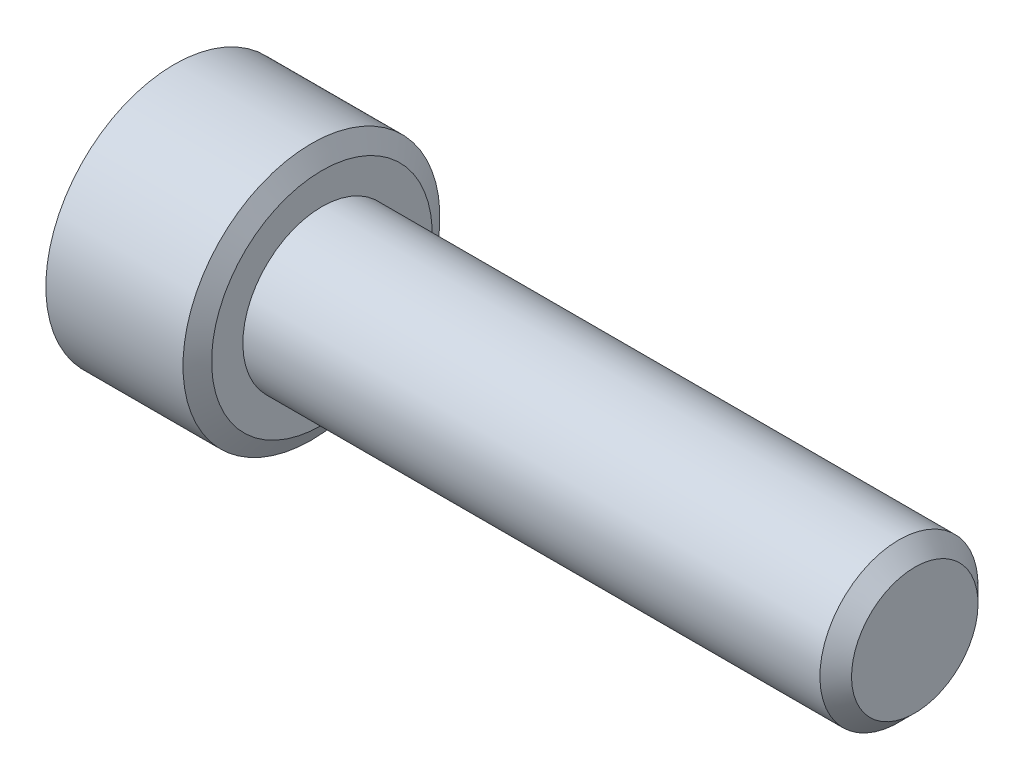
ISO-10303-21;
HEADER;
FILE_DESCRIPTION(('STEP AP214'),'2;1');
FILE_NAME('part.step','',(''),(''),'','','');
FILE_SCHEMA(('AUTOMOTIVE_DESIGN { 1 0 10303 214 1 1 1 1 }'));
ENDSEC;
DATA;
#1=APPLICATION_CONTEXT('core data for automotive mechanical design processes');
#2=APPLICATION_PROTOCOL_DEFINITION('international standard','automotive_design',2000,#1);
#3=PRODUCT_CONTEXT('',#1,'mechanical');
#4=PRODUCT('Part','Part','',(#3));
#5=PRODUCT_RELATED_PRODUCT_CATEGORY('part','',(#4));
#6=PRODUCT_DEFINITION_FORMATION('','',#4);
#7=PRODUCT_DEFINITION_CONTEXT('part definition',#1,'design');
#8=PRODUCT_DEFINITION('design','',#6,#7);
#9=PRODUCT_DEFINITION_SHAPE('','',#8);
#10=(LENGTH_UNIT() NAMED_UNIT(*) SI_UNIT(.MILLI.,.METRE.));
#11=(NAMED_UNIT(*) PLANE_ANGLE_UNIT() SI_UNIT($,.RADIAN.));
#12=(NAMED_UNIT(*) SI_UNIT($,.STERADIAN.) SOLID_ANGLE_UNIT());
#13=UNCERTAINTY_MEASURE_WITH_UNIT(LENGTH_MEASURE(1.E-05),#10,'distance_accuracy_value','');
#14=(GEOMETRIC_REPRESENTATION_CONTEXT(3) GLOBAL_UNCERTAINTY_ASSIGNED_CONTEXT((#13)) GLOBAL_UNIT_ASSIGNED_CONTEXT((#10,
#11,#12)) REPRESENTATION_CONTEXT('',''));
#15=CARTESIAN_POINT('',(0.,0.,0.));
#16=DIRECTION('',(0.,0.,1.));
#17=DIRECTION('',(1.,0.,0.));
#18=AXIS2_PLACEMENT_3D('',#15,#16,#17);
#19=CARTESIAN_POINT('',(0.,0.,0.));
#20=DIRECTION('',(-1.,0.,0.));
#21=DIRECTION('',(0.,-1.,0.));
#22=AXIS2_PLACEMENT_3D('',#19,#20,#21);
#23=PLANE('',#22);
#24=CARTESIAN_POINT('',(0.,0.,0.));
#25=DIRECTION('',(-1.,0.,0.));
#26=DIRECTION('',(0.,0.,1.));
#27=AXIS2_PLACEMENT_3D('',#24,#25,#26);
#28=CIRCLE('',#27,4.);
#29=CARTESIAN_POINT('',(0.,0.,4.));
#30=VERTEX_POINT('',#29);
#31=EDGE_CURVE('E206',#30,#30,#28,.T.);
#32=ORIENTED_EDGE('',*,*,#31,.F.);
#33=EDGE_LOOP('',(#32));
#34=FACE_BOUND('',#33,.T.);
#35=CARTESIAN_POINT('',(0.,0.,0.));
#36=DIRECTION('',(1.,0.,0.));
#37=DIRECTION('',(0.,1.,0.));
#38=AXIS2_PLACEMENT_3D('',#35,#36,#37);
#39=CIRCLE('',#38,5.58201307198849);
#40=CARTESIAN_POINT('',(0.,5.58201307198849,0.));
#41=VERTEX_POINT('',#40);
#42=EDGE_CURVE('E235',#41,#41,#39,.T.);
#43=ORIENTED_EDGE('',*,*,#42,.F.);
#44=EDGE_LOOP('',(#43));
#45=FACE_BOUND('',#44,.T.);
#46=ADVANCED_FACE('F33',(#34,#45),#23,.T.);
#47=CARTESIAN_POINT('',(0.530000000000003,0.,0.));
#48=DIRECTION('',(1.,0.,0.));
#49=DIRECTION('',(0.,1.,0.));
#50=AXIS2_PLACEMENT_3D('',#47,#48,#49);
#51=CONICAL_SURFACE('',#50,6.5,1.0471975511966);
#52=ORIENTED_EDGE('',*,*,#42,.T.);
#53=EDGE_LOOP('',(#52));
#54=FACE_BOUND('',#53,.T.);
#55=CARTESIAN_POINT('',(0.530000000000003,0.,0.));
#56=DIRECTION('',(1.,0.,0.));
#57=DIRECTION('',(0.,1.,0.));
#58=AXIS2_PLACEMENT_3D('',#55,#56,#57);
#59=CIRCLE('',#58,6.5);
#60=CARTESIAN_POINT('',(0.530000000000003,6.5,0.));
#61=VERTEX_POINT('',#60);
#62=EDGE_CURVE('E232',#61,#61,#59,.T.);
#63=ORIENTED_EDGE('',*,*,#62,.F.);
#64=EDGE_LOOP('',(#63));
#65=FACE_BOUND('',#64,.T.);
#66=ADVANCED_FACE('F104',(#54,#65),#51,.T.);
#67=CARTESIAN_POINT('',(38.,0.,0.));
#68=DIRECTION('',(1.,0.,0.));
#69=DIRECTION('',(0.,1.,0.));
#70=AXIS2_PLACEMENT_3D('',#67,#68,#69);
#71=CYLINDRICAL_SURFACE('',#70,6.5);
#72=ORIENTED_EDGE('',*,*,#62,.T.);
#73=EDGE_LOOP('',(#72));
#74=FACE_BOUND('',#73,.T.);
#75=CARTESIAN_POINT('',(7.47,0.,0.));
#76=DIRECTION('',(1.,0.,0.));
#77=DIRECTION('',(0.,1.,0.));
#78=AXIS2_PLACEMENT_3D('',#75,#76,#77);
#79=CIRCLE('',#78,6.5);
#80=CARTESIAN_POINT('',(7.47,6.5,0.));
#81=VERTEX_POINT('',#80);
#82=EDGE_CURVE('E229',#81,#81,#79,.T.);
#83=ORIENTED_EDGE('',*,*,#82,.F.);
#84=EDGE_LOOP('',(#83));
#85=FACE_BOUND('',#84,.T.);
#86=ADVANCED_FACE('F109',(#74,#85),#71,.T.);
#87=CARTESIAN_POINT('',(8.,0.,0.));
#88=DIRECTION('',(-1.,0.,0.));
#89=DIRECTION('',(0.,-1.,0.));
#90=AXIS2_PLACEMENT_3D('',#87,#88,#89);
#91=CONICAL_SURFACE('',#90,5.58201307198849,1.0471975511966);
#92=ORIENTED_EDGE('',*,*,#82,.T.);
#93=EDGE_LOOP('',(#92));
#94=FACE_BOUND('',#93,.T.);
#95=CARTESIAN_POINT('',(8.,0.,0.));
#96=DIRECTION('',(1.,0.,0.));
#97=DIRECTION('',(0.,1.,0.));
#98=AXIS2_PLACEMENT_3D('',#95,#96,#97);
#99=CIRCLE('',#98,5.58201307198849);
#100=CARTESIAN_POINT('',(8.,5.58201307198849,0.));
#101=VERTEX_POINT('',#100);
#102=EDGE_CURVE('E225',#101,#101,#99,.T.);
#103=ORIENTED_EDGE('',*,*,#102,.F.);
#104=EDGE_LOOP('',(#103));
#105=FACE_BOUND('',#104,.T.);
#106=ADVANCED_FACE('F117',(#94,#105),#91,.T.);
#107=CARTESIAN_POINT('',(8.,5.58201307198849,0.));
#108=DIRECTION('',(1.,0.,0.));
#109=DIRECTION('',(0.,1.,0.));
#110=AXIS2_PLACEMENT_3D('',#107,#108,#109);
#111=PLANE('',#110);
#112=ORIENTED_EDGE('',*,*,#102,.T.);
#113=EDGE_LOOP('',(#112));
#114=FACE_BOUND('',#113,.T.);
#115=CARTESIAN_POINT('',(8.,0.,0.));
#116=DIRECTION('',(1.,0.,0.));
#117=DIRECTION('',(0.,1.,0.));
#118=AXIS2_PLACEMENT_3D('',#115,#116,#117);
#119=CIRCLE('',#118,4.);
#120=CARTESIAN_POINT('',(8.,4.,0.));
#121=VERTEX_POINT('',#120);
#122=EDGE_CURVE('E222',#121,#121,#119,.T.);
#123=ORIENTED_EDGE('',*,*,#122,.F.);
#124=EDGE_LOOP('',(#123));
#125=FACE_BOUND('',#124,.T.);
#126=ADVANCED_FACE('F121',(#114,#125),#111,.T.);
#127=CARTESIAN_POINT('',(38.,0.,0.));
#128=DIRECTION('',(1.,0.,0.));
#129=DIRECTION('',(0.,1.,0.));
#130=AXIS2_PLACEMENT_3D('',#127,#128,#129);
#131=CYLINDRICAL_SURFACE('',#130,4.);
#132=CARTESIAN_POINT('',(37.2,0.,0.));
#133=DIRECTION('',(1.,0.,0.));
#134=DIRECTION('',(0.,1.,0.));
#135=AXIS2_PLACEMENT_3D('',#132,#133,#134);
#136=CIRCLE('',#135,4.);
#137=CARTESIAN_POINT('',(37.2,4.,0.));
#138=VERTEX_POINT('',#137);
#139=EDGE_CURVE('E46',#138,#138,#136,.F.);
#140=ORIENTED_EDGE('',*,*,#139,.T.);
#141=EDGE_LOOP('',(#140));
#142=FACE_BOUND('',#141,.T.);
#143=ORIENTED_EDGE('',*,*,#122,.T.);
#144=EDGE_LOOP('',(#143));
#145=FACE_BOUND('',#144,.T.);
#146=ADVANCED_FACE('F125',(#142,#145),#131,.T.);
#147=CARTESIAN_POINT('',(38.,4.,0.));
#148=DIRECTION('',(1.,0.,0.));
#149=DIRECTION('',(0.,1.,0.));
#150=AXIS2_PLACEMENT_3D('',#147,#148,#149);
#151=PLANE('',#150);
#152=CARTESIAN_POINT('',(38.,0.,0.));
#153=DIRECTION('',(1.,0.,0.));
#154=DIRECTION('',(0.,1.,0.));
#155=AXIS2_PLACEMENT_3D('',#152,#153,#154);
#156=CIRCLE('',#155,3.19999999999999);
#157=CARTESIAN_POINT('',(38.,3.19999999999999,0.));
#158=VERTEX_POINT('',#157);
#159=EDGE_CURVE('E238',#158,#158,#156,.T.);
#160=ORIENTED_EDGE('',*,*,#159,.T.);
#161=EDGE_LOOP('',(#160));
#162=FACE_BOUND('',#161,.T.);
#163=ADVANCED_FACE('F129',(#162),#151,.T.);
#164=CARTESIAN_POINT('',(38.,0.,0.));
#165=DIRECTION('',(-1.,0.,0.));
#166=DIRECTION('',(0.,-1.,0.));
#167=AXIS2_PLACEMENT_3D('',#164,#165,#166);
#168=CONICAL_SURFACE('',#167,3.19999999999999,0.785398163397448);
#169=ORIENTED_EDGE('',*,*,#139,.F.);
#170=EDGE_LOOP('',(#169));
#171=FACE_BOUND('',#170,.T.);
#172=ORIENTED_EDGE('',*,*,#159,.F.);
#173=EDGE_LOOP('',(#172));
#174=FACE_BOUND('',#173,.T.);
#175=ADVANCED_FACE('F35',(#171,#174),#168,.T.);
#176=CARTESIAN_POINT('',(2.30940107675847,0.,0.));
#177=DIRECTION('',(-1.,0.,0.));
#178=DIRECTION('',(0.,0.,1.));
#179=AXIS2_PLACEMENT_3D('',#176,#177,#178);
#180=CONICAL_SURFACE('',#179,0.,1.0471975511966);
#181=ORIENTED_EDGE('',*,*,#31,.T.);
#182=EDGE_LOOP('',(#181));
#183=FACE_BOUND('',#182,.T.);
#184=CARTESIAN_POINT('',(0.142667740348338,0.000200000000001305,3.7528922197864));
#185=CARTESIAN_POINT('',(0.190292955189627,-0.142621192519365,3.67043436583937));
#186=CARTESIAN_POINT('',(0.233606431856647,-0.286675208092869,3.58726474117016));
#187=CARTESIAN_POINT('',(0.309210723922063,-0.577277713285694,3.4194853065699));
#188=CARTESIAN_POINT('',(0.341474792986621,-0.723831366706378,3.33487251531674));
#189=CARTESIAN_POINT('',(0.391698768714531,-1.0151224062323,3.16669555523393));
#190=CARTESIAN_POINT('',(0.409992938219789,-1.15981497228843,3.08315726327169));
#191=CARTESIAN_POINT('',(0.431832814317876,-1.44988097224261,2.91568758011538));
#192=CARTESIAN_POINT('',(0.435396605746873,-1.5952533517485,2.83175679767492));
#193=CARTESIAN_POINT('',(0.427984785522013,-1.86689240880062,2.67492591496346));
#194=CARTESIAN_POINT('',(0.418829027767469,-1.99319973870853,2.60200234404051));
#195=CARTESIAN_POINT('',(0.389809996939981,-2.24499150262694,2.45663030136248));
#196=CARTESIAN_POINT('',(0.369936809818711,-2.37047506566399,2.38418233246417));
#197=CARTESIAN_POINT('',(0.320255122527025,-2.62278602472761,2.23851053232929));
#198=CARTESIAN_POINT('',(0.290236012042401,-2.749581484893,2.16530513927078));
#199=CARTESIAN_POINT('',(0.222104337430199,-3.00128122171967,2.01998622845895));
#200=CARTESIAN_POINT('',(0.184007783111051,-3.12618872331862,1.94787084878699));
#201=CARTESIAN_POINT('',(0.142667740348337,-3.2502,1.87627290481245));
#202=B_SPLINE_CURVE_WITH_KNOTS('',3,(#184,#185,#186,#187,#188,#189,#190,#191,#192,#193,#194,
#195,#196,#197,#198,#199,#200,#201),.UNSPECIFIED.,.F.,.F.,(4,2,2,2,2,2,2,2,4),(0.,
0.515166831490569,1.03157201112063,1.53519622021026,2.03820193386596,2.47618783582282,
2.91457958885821,3.3626959233107,3.80993224062138),.UNSPECIFIED.);
#203=CARTESIAN_POINT('',(0.142734410091833,0.,3.75277674973257));
#204=VERTEX_POINT('',#203);
#205=CARTESIAN_POINT('',(0.142734410091832,-3.25,1.87638837486628));
#206=VERTEX_POINT('',#205);
#207=EDGE_CURVE('E142',#204,#206,#202,.T.);
#208=ORIENTED_EDGE('',*,*,#207,.T.);
#209=CARTESIAN_POINT('',(-1.08369255627148,-3.25,-4.89660629492775));
#210=CARTESIAN_POINT('',(-1.01594975570711,-3.25,-4.75573833218523));
#211=CARTESIAN_POINT('',(-0.948899760360457,-3.25,-4.61453096698139));
#212=CARTESIAN_POINT('',(-0.816578471556632,-3.25,-4.33125620706581));
#213=CARTESIAN_POINT('',(-0.751307491306539,-3.25,-4.18918866622696));
#214=CARTESIAN_POINT('',(-0.622577708131285,-3.25,-3.90320931978041));
#215=CARTESIAN_POINT('',(-0.559132069888944,-3.25,-3.75929156621239));
#216=CARTESIAN_POINT('',(-0.435038922527753,-3.25,-3.4702590844915));
#217=CARTESIAN_POINT('',(-0.374391269946109,-3.25,-3.32514441815938));
#218=CARTESIAN_POINT('',(-0.255034292124207,-3.25,-3.02951456699183));
#219=CARTESIAN_POINT('',(-0.19642244636189,-3.25,-2.87895979613733));
#220=CARTESIAN_POINT('',(-0.0839927099501653,-3.25,-2.57603706437933));
#221=CARTESIAN_POINT('',(-0.0301753757864966,-3.25,-2.42366889532025));
#222=CARTESIAN_POINT('',(0.0711470948775593,-3.25,-2.11721147620763));
#223=CARTESIAN_POINT('',(0.118666342513274,-3.25,-1.96312694192655));
#224=CARTESIAN_POINT('',(0.205775052993384,-3.25,-1.65275510414817));
#225=CARTESIAN_POINT('',(0.245367168309315,-3.25,-1.49646855625799));
#226=CARTESIAN_POINT('',(0.314443575599648,-3.25,-1.18238091695868));
#227=CARTESIAN_POINT('',(0.343973067324083,-3.25,-1.0245899609261));
#228=CARTESIAN_POINT('',(0.391140063964164,-3.25,-0.707207163555436));
#229=CARTESIAN_POINT('',(0.408778448877573,-3.25,-0.547615456370329));
#230=CARTESIAN_POINT('',(0.430525519499226,-3.25,-0.229445619508179));
#231=CARTESIAN_POINT('',(0.434796579763025,-3.25,-0.0708788640805282));
#232=CARTESIAN_POINT('',(0.429866218373042,-3.25,0.246055627179557));
#233=CARTESIAN_POINT('',(0.420664017089997,-3.25,0.404423350964304));
#234=CARTESIAN_POINT('',(0.393787684326083,-3.25,0.677673438491509));
#235=CARTESIAN_POINT('',(0.379037656172077,-3.25,0.792857822716928));
#236=CARTESIAN_POINT('',(0.343410135455893,-3.25,1.02228182413567));
#237=CARTESIAN_POINT('',(0.32253168647263,-3.25,1.13652129099876));
#238=CARTESIAN_POINT('',(0.251812366920672,-3.25,1.4777218748365));
#239=CARTESIAN_POINT('',(0.193903151527147,-3.25,1.70302389459132));
#240=CARTESIAN_POINT('',(0.0947403883219257,-3.25,2.03991920989564));
#241=CARTESIAN_POINT('',(0.0591736318103019,-3.25,2.1532840171806));
#242=CARTESIAN_POINT('',(-0.0153319412686152,-3.25,2.37891078375274));
#243=CARTESIAN_POINT('',(-0.054270782126585,-3.25,2.49117273508905));
#244=CARTESIAN_POINT('',(-0.134922514415035,-3.25,2.71463755498964));
#245=CARTESIAN_POINT('',(-0.176634325866061,-3.25,2.82584081681016));
#246=CARTESIAN_POINT('',(-0.262373539705769,-3.25,3.04734627101052));
#247=CARTESIAN_POINT('',(-0.306400901706733,-3.25,3.15764847906776));
#248=CARTESIAN_POINT('',(-0.422900517805911,-3.25,3.44225693000615));
#249=CARTESIAN_POINT('',(-0.49684076847158,-3.25,3.61596153730326));
#250=CARTESIAN_POINT('',(-0.648384160787778,-3.25,3.96177061881111));
#251=CARTESIAN_POINT('',(-0.725987594706801,-3.25,4.1338749640286));
#252=CARTESIAN_POINT('',(-0.884020946334187,-3.25,4.47683046628309));
#253=CARTESIAN_POINT('',(-0.964451578158969,-3.25,4.64768129333137));
#254=CARTESIAN_POINT('',(-1.12750437614587,-3.25,4.98833568172965));
#255=CARTESIAN_POINT('',(-1.21012659352125,-3.25,5.15813921849197));
#256=CARTESIAN_POINT('',(-1.46076843846882,-3.25,5.66669771876752));
#257=CARTESIAN_POINT('',(-1.63136670466568,-3.25,6.00418052132547));
#258=CARTESIAN_POINT('',(-1.97696773868428,-3.25,6.67680247739871));
#259=CARTESIAN_POINT('',(-2.15196982934708,-3.25,7.01194198122852));
#260=CARTESIAN_POINT('',(-2.48799171546994,-3.25,7.64835455593647));
#261=CARTESIAN_POINT('',(-2.64873165029459,-3.25,7.94977563042362));
#262=CARTESIAN_POINT('',(-2.97204613549434,-3.25,8.55164830810501));
#263=CARTESIAN_POINT('',(-3.13462076864497,-3.25,8.85209986676516));
#264=CARTESIAN_POINT('',(-3.46070952063343,-3.25,9.45145987511712));
#265=CARTESIAN_POINT('',(-3.62422000561399,-3.25,9.75037030405654));
#266=CARTESIAN_POINT('',(-3.9523021172079,-3.25,10.3475848815939));
#267=CARTESIAN_POINT('',(-4.11687367889492,-3.25,10.6458890658456));
#268=CARTESIAN_POINT('',(-4.28183374369151,-3.25,10.9439768537283));
#269=B_SPLINE_CURVE_WITH_KNOTS('',3,(#209,#210,#211,#212,#213,#214,#215,#216,#217,#218,#219,
#220,#221,#222,#223,#224,#225,#226,#227,#228,#229,#230,#231,#232,#233,#234,#235,#236,#237,#238,
#239,#240,#241,#242,#243,#244,#245,#246,#247,#248,#249,#250,#251,#252,#253,#254,#255,#256,#257,
#258,#259,#260,#261,#262,#263,#264,#265,#266,#267,#268),.UNSPECIFIED.,.F.,.F.,(4,2,2,2,2,2,2,2,
2,2,2,2,2,2,2,2,2,2,2,2,2,2,2,2,2,2,2,2,2,4),(0.,0.468937011905253,0.937956056781094,
1.40977870419016,1.88157713260634,2.36619833411049,2.85087571117736,3.33444809662955,
3.81785840411545,4.29906776592849,4.78024151207786,5.25554723347935,5.73088045949757,
6.07908380149246,6.42734151414057,7.12428147334441,7.48069507094447,7.83711123616941,
8.19338939334233,8.54966133838879,9.11596026782665,9.6823044562655,10.2487927392046,
10.8152942715988,11.9496883220206,13.0839089942731,14.1087066661116,15.1335507597631,
16.1556775715809,17.1777424229543),.UNSPECIFIED.);
#270=CARTESIAN_POINT('',(0.142734410091832,-3.25,-1.87638837486628));
#271=VERTEX_POINT('',#270);
#272=EDGE_CURVE('E149',#206,#271,#269,.F.);
#273=ORIENTED_EDGE('',*,*,#272,.T.);
#274=CARTESIAN_POINT('',(0.142667740348337,-3.2502,-1.87627290481245));
#275=CARTESIAN_POINT('',(0.190292955189627,-3.10737880748063,-1.95873075875949));
#276=CARTESIAN_POINT('',(0.233606431856647,-2.96332479190713,-2.04190038342869));
#277=CARTESIAN_POINT('',(0.309210723922063,-2.67272228671431,-2.20967981802895));
#278=CARTESIAN_POINT('',(0.34147479298662,-2.52616863329362,-2.29429260928211));
#279=CARTESIAN_POINT('',(0.39169876871453,-2.2348775937677,-2.46246956936492));
#280=CARTESIAN_POINT('',(0.409992938219788,-2.09018502771157,-2.54600786132717));
#281=CARTESIAN_POINT('',(0.431832814317876,-1.80011902775739,-2.71347754448347));
#282=CARTESIAN_POINT('',(0.435396605746872,-1.6547466482515,-2.79740832692393));
#283=CARTESIAN_POINT('',(0.427984785522013,-1.38310759119938,-2.95423920963539));
#284=CARTESIAN_POINT('',(0.418829027767469,-1.25680026129147,-3.02716278055835));
#285=CARTESIAN_POINT('',(0.389809996939981,-1.00500849737306,-3.17253482323637));
#286=CARTESIAN_POINT('',(0.369936809818711,-0.879524934336009,-3.24498279213469));
#287=CARTESIAN_POINT('',(0.320255122527024,-0.627213975272391,-3.39065459226956));
#288=CARTESIAN_POINT('',(0.290236012042401,-0.500418515106996,-3.46385998532807));
#289=CARTESIAN_POINT('',(0.222104337430199,-0.248718778280335,-3.6091788961399));
#290=CARTESIAN_POINT('',(0.184007783111051,-0.123811276681381,-3.68129427581186));
#291=CARTESIAN_POINT('',(0.142667740348337,0.000200000000000175,-3.75289221978641));
#292=B_SPLINE_CURVE_WITH_KNOTS('',3,(#274,#275,#276,#277,#278,#279,#280,#281,#282,#283,#284,
#285,#286,#287,#288,#289,#290,#291),.UNSPECIFIED.,.F.,.F.,(4,2,2,2,2,2,2,2,4),(0.,
0.51516683149057,1.03157201112063,1.53519622021026,2.03820193386596,2.47618783582282,
2.91457958885821,3.3626959233107,3.80993224062138),.UNSPECIFIED.);
#293=CARTESIAN_POINT('',(0.142734410091832,0.,-3.75277674973257));
#294=VERTEX_POINT('',#293);
#295=EDGE_CURVE('E176',#271,#294,#292,.T.);
#296=ORIENTED_EDGE('',*,*,#295,.T.);
#297=CARTESIAN_POINT('',(0.142667740348337,-0.000200000000000034,-3.75289221978641));
#298=CARTESIAN_POINT('',(0.190292955189626,0.142621192519366,-3.67043436583937));
#299=CARTESIAN_POINT('',(0.233606431856647,0.28667520809287,-3.58726474117016));
#300=CARTESIAN_POINT('',(0.309210723922063,0.577277713285695,-3.4194853065699));
#301=CARTESIAN_POINT('',(0.34147479298662,0.723831366706379,-3.33487251531675));
#302=CARTESIAN_POINT('',(0.39169876871453,1.0151224062323,-3.16669555523393));
#303=CARTESIAN_POINT('',(0.409992938219788,1.15981497228843,-3.08315726327169));
#304=CARTESIAN_POINT('',(0.431832814317876,1.44988097224262,-2.91568758011538));
#305=CARTESIAN_POINT('',(0.435396605746872,1.5952533517485,-2.83175679767492));
#306=CARTESIAN_POINT('',(0.427984785522013,1.86689240880062,-2.67492591496346));
#307=CARTESIAN_POINT('',(0.418829027767469,1.99319973870853,-2.60200234404051));
#308=CARTESIAN_POINT('',(0.389809996939981,2.24499150262694,-2.45663030136248));
#309=CARTESIAN_POINT('',(0.369936809818711,2.37047506566399,-2.38418233246417));
#310=CARTESIAN_POINT('',(0.320255122527024,2.62278602472761,-2.23851053232929));
#311=CARTESIAN_POINT('',(0.290236012042401,2.749581484893,-2.16530513927078));
#312=CARTESIAN_POINT('',(0.222104337430199,3.00128122171967,-2.01998622845895));
#313=CARTESIAN_POINT('',(0.184007783111051,3.12618872331862,-1.94787084878699));
#314=CARTESIAN_POINT('',(0.142667740348337,3.2502,-1.87627290481245));
#315=B_SPLINE_CURVE_WITH_KNOTS('',3,(#297,#298,#299,#300,#301,#302,#303,#304,#305,#306,#307,
#308,#309,#310,#311,#312,#313,#314),.UNSPECIFIED.,.F.,.F.,(4,2,2,2,2,2,2,2,4),(0.,
0.515166831490569,1.03157201112063,1.53519622021026,2.03820193386596,2.47618783582282,
2.91457958885821,3.3626959233107,3.80993224062138),.UNSPECIFIED.);
#316=CARTESIAN_POINT('',(0.142734410091832,3.25,-1.87638837486628));
#317=VERTEX_POINT('',#316);
#318=EDGE_CURVE('E171',#294,#317,#315,.T.);
#319=ORIENTED_EDGE('',*,*,#318,.T.);
#320=CARTESIAN_POINT('',(-1.08369255627148,3.25,-4.89660629492775));
#321=CARTESIAN_POINT('',(-1.01594975570711,3.25,-4.75573833218522));
#322=CARTESIAN_POINT('',(-0.948899760360456,3.25,-4.61453096698139));
#323=CARTESIAN_POINT('',(-0.816578471556632,3.25,-4.3312562070658));
#324=CARTESIAN_POINT('',(-0.751307491306538,3.25,-4.18918866622696));
#325=CARTESIAN_POINT('',(-0.622577708131285,3.25,-3.90320931978041));
#326=CARTESIAN_POINT('',(-0.559132069888944,3.25,-3.75929156621239));
#327=CARTESIAN_POINT('',(-0.435038922527753,3.25,-3.4702590844915));
#328=CARTESIAN_POINT('',(-0.374391269946109,3.25,-3.32514441815938));
#329=CARTESIAN_POINT('',(-0.255034292124207,3.25,-3.02951456699183));
#330=CARTESIAN_POINT('',(-0.19642244636189,3.25,-2.87895979613733));
#331=CARTESIAN_POINT('',(-0.0839927099501653,3.25,-2.57603706437933));
#332=CARTESIAN_POINT('',(-0.0301753757864971,3.25,-2.42366889532025));
#333=CARTESIAN_POINT('',(0.0711470948775586,3.25,-2.11721147620763));
#334=CARTESIAN_POINT('',(0.118666342513274,3.25,-1.96312694192655));
#335=CARTESIAN_POINT('',(0.205775052993384,3.25,-1.65275510414817));
#336=CARTESIAN_POINT('',(0.245367168309315,3.25,-1.49646855625799));
#337=CARTESIAN_POINT('',(0.314443575599648,3.25,-1.18238091695868));
#338=CARTESIAN_POINT('',(0.343973067324083,3.25,-1.0245899609261));
#339=CARTESIAN_POINT('',(0.391140063964164,3.25,-0.707207163555437));
#340=CARTESIAN_POINT('',(0.408778448877573,3.25,-0.54761545637033));
#341=CARTESIAN_POINT('',(0.430525519499226,3.25,-0.229445619508179));
#342=CARTESIAN_POINT('',(0.434796579763025,3.25,-0.070878864080529));
#343=CARTESIAN_POINT('',(0.429866218373042,3.25,0.246055627179556));
#344=CARTESIAN_POINT('',(0.420664017089997,3.25,0.404423350964304));
#345=CARTESIAN_POINT('',(0.393787684326083,3.25,0.677673438491509));
#346=CARTESIAN_POINT('',(0.379037656172077,3.25,0.792857822716927));
#347=CARTESIAN_POINT('',(0.343410135455893,3.25,1.02228182413567));
#348=CARTESIAN_POINT('',(0.322531686472631,3.25,1.13652129099876));
#349=CARTESIAN_POINT('',(0.251812366920672,3.25,1.4777218748365));
#350=CARTESIAN_POINT('',(0.193903151527147,3.25,1.70302389459132));
#351=CARTESIAN_POINT('',(0.0947403883219262,3.25,2.03991920989564));
#352=CARTESIAN_POINT('',(0.0591736318103026,3.25,2.1532840171806));
#353=CARTESIAN_POINT('',(-0.0153319412686145,3.25,2.37891078375274));
#354=CARTESIAN_POINT('',(-0.0542707821265845,3.25,2.49117273508905));
#355=CARTESIAN_POINT('',(-0.134922514415035,3.25,2.71463755498964));
#356=CARTESIAN_POINT('',(-0.176634325866061,3.25,2.82584081681015));
#357=CARTESIAN_POINT('',(-0.262373539705769,3.25,3.04734627101052));
#358=CARTESIAN_POINT('',(-0.306400901706733,3.25,3.15764847906776));
#359=CARTESIAN_POINT('',(-0.422900517805911,3.25,3.44225693000615));
#360=CARTESIAN_POINT('',(-0.49684076847158,3.25,3.61596153730326));
#361=CARTESIAN_POINT('',(-0.648384160787779,3.25,3.96177061881111));
#362=CARTESIAN_POINT('',(-0.725987594706802,3.25,4.1338749640286));
#363=CARTESIAN_POINT('',(-0.884020946334188,3.25,4.47683046628309));
#364=CARTESIAN_POINT('',(-0.96445157815897,3.25,4.64768129333137));
#365=CARTESIAN_POINT('',(-1.12750437614587,3.25,4.98833568172965));
#366=CARTESIAN_POINT('',(-1.21012659352125,3.25,5.15813921849197));
#367=CARTESIAN_POINT('',(-1.46076843846881,3.25,5.66669771876753));
#368=CARTESIAN_POINT('',(-1.63136670466568,3.25,6.00418052132547));
#369=CARTESIAN_POINT('',(-1.97696773868428,3.25,6.67680247739871));
#370=CARTESIAN_POINT('',(-2.15196982934708,3.25,7.01194198122852));
#371=CARTESIAN_POINT('',(-2.48799171546994,3.25,7.64835455593648));
#372=CARTESIAN_POINT('',(-2.64873165029459,3.25,7.94977563042361));
#373=CARTESIAN_POINT('',(-2.97204613549434,3.25,8.55164830810501));
#374=CARTESIAN_POINT('',(-3.13462076864497,3.25,8.85209986676516));
#375=CARTESIAN_POINT('',(-3.46070952063343,3.25,9.45145987511711));
#376=CARTESIAN_POINT('',(-3.62422000561399,3.25,9.75037030405653));
#377=CARTESIAN_POINT('',(-3.9523021172079,3.25,10.3475848815939));
#378=CARTESIAN_POINT('',(-4.11687367889492,3.25,10.6458890658456));
#379=CARTESIAN_POINT('',(-4.2818337436915,3.25,10.9439768537283));
#380=B_SPLINE_CURVE_WITH_KNOTS('',3,(#320,#321,#322,#323,#324,#325,#326,#327,#328,#329,#330,
#331,#332,#333,#334,#335,#336,#337,#338,#339,#340,#341,#342,#343,#344,#345,#346,#347,#348,#349,
#350,#351,#352,#353,#354,#355,#356,#357,#358,#359,#360,#361,#362,#363,#364,#365,#366,#367,#368,
#369,#370,#371,#372,#373,#374,#375,#376,#377,#378,#379),.UNSPECIFIED.,.F.,.F.,(4,2,2,2,2,2,2,2,
2,2,2,2,2,2,2,2,2,2,2,2,2,2,2,2,2,2,2,2,2,4),(0.,0.468937011905254,0.937956056781095,
1.40977870419016,1.88157713260634,2.36619833411049,2.85087571117736,3.33444809662955,
3.81785840411545,4.29906776592849,4.78024151207785,5.25554723347934,5.73088045949756,
6.07908380149246,6.42734151414057,7.12428147334441,7.48069507094447,7.8371112361694,
8.19338939334233,8.54966133838878,9.11596026782665,9.68230445626549,10.2487927392046,
10.8152942715988,11.9496883220206,13.0839089942731,14.1087066661116,15.1335507597631,
16.1556775715809,17.1777424229543),.UNSPECIFIED.);
#381=CARTESIAN_POINT('',(0.142734410091833,3.25,1.87638837486628));
#382=VERTEX_POINT('',#381);
#383=EDGE_CURVE('E52',#317,#382,#380,.T.);
#384=ORIENTED_EDGE('',*,*,#383,.T.);
#385=CARTESIAN_POINT('',(0.142667740348338,3.2502,1.87627290481244));
#386=CARTESIAN_POINT('',(0.190292955189627,3.10737880748064,1.95873075875948));
#387=CARTESIAN_POINT('',(0.233606431856647,2.96332479190713,2.04190038342869));
#388=CARTESIAN_POINT('',(0.309210723922063,2.67272228671431,2.20967981802895));
#389=CARTESIAN_POINT('',(0.341474792986621,2.52616863329362,2.29429260928211));
#390=CARTESIAN_POINT('',(0.39169876871453,2.2348775937677,2.46246956936492));
#391=CARTESIAN_POINT('',(0.409992938219789,2.09018502771158,2.54600786132716));
#392=CARTESIAN_POINT('',(0.431832814317876,1.80011902775739,2.71347754448347));
#393=CARTESIAN_POINT('',(0.435396605746873,1.6547466482515,2.79740832692393));
#394=CARTESIAN_POINT('',(0.427984785522014,1.38310759119938,2.95423920963539));
#395=CARTESIAN_POINT('',(0.418829027767469,1.25680026129147,3.02716278055834));
#396=CARTESIAN_POINT('',(0.389809996939981,1.00500849737306,3.17253482323637));
#397=CARTESIAN_POINT('',(0.369936809818712,0.87952493433601,3.24498279213468));
#398=CARTESIAN_POINT('',(0.320255122527025,0.627213975272392,3.39065459226956));
#399=CARTESIAN_POINT('',(0.290236012042402,0.500418515106998,3.46385998532807));
#400=CARTESIAN_POINT('',(0.2221043374302,0.248718778280337,3.6091788961399));
#401=CARTESIAN_POINT('',(0.184007783111052,0.123811276681382,3.68129427581186));
#402=CARTESIAN_POINT('',(0.142667740348338,-0.000199999999998895,3.7528922197864));
#403=B_SPLINE_CURVE_WITH_KNOTS('',3,(#385,#386,#387,#388,#389,#390,#391,#392,#393,#394,#395,
#396,#397,#398,#399,#400,#401,#402),.UNSPECIFIED.,.F.,.F.,(4,2,2,2,2,2,2,2,4),(0.,
0.515166831490569,1.03157201112063,1.53519622021026,2.03820193386596,2.47618783582282,
2.91457958885821,3.3626959233107,3.80993224062138),.UNSPECIFIED.);
#404=EDGE_CURVE('E11',#382,#204,#403,.T.);
#405=ORIENTED_EDGE('',*,*,#404,.T.);
#406=EDGE_LOOP('',(#208,#273,#296,#319,#384,#405));
#407=FACE_BOUND('',#406,.T.);
#408=ADVANCED_FACE('F156',(#183,#407),#180,.F.);
#409=CARTESIAN_POINT('',(6.,0.,3.75277674973257));
#410=DIRECTION('',(0.,0.5,0.866025403784438));
#411=DIRECTION('',(0.,-0.866025403784439,0.5));
#412=AXIS2_PLACEMENT_3D('',#409,#410,#411);
#413=PLANE('',#412);
#414=ORIENTED_EDGE('',*,*,#404,.F.);
#415=DIRECTION('',(-1.,0.,0.));
#416=VECTOR('',#415,1.);
#417=CARTESIAN_POINT('',(6.,3.25,1.87638837486628));
#418=LINE('',#417,#416);
#419=CARTESIAN_POINT('',(6.,3.25,1.87638837486628));
#420=VERTEX_POINT('',#419);
#421=EDGE_CURVE('E205',#420,#382,#418,.T.);
#422=ORIENTED_EDGE('',*,*,#421,.F.);
#423=DIRECTION('',(0.,0.866025403784439,-0.5));
#424=VECTOR('',#423,1.);
#425=CARTESIAN_POINT('',(6.,0.,3.75277674973257));
#426=LINE('',#425,#424);
#427=CARTESIAN_POINT('',(6.,0.,3.75277674973257));
#428=VERTEX_POINT('',#427);
#429=EDGE_CURVE('E320',#428,#420,#426,.T.);
#430=ORIENTED_EDGE('',*,*,#429,.F.);
#431=DIRECTION('',(-1.,0.,0.));
#432=VECTOR('',#431,1.);
#433=CARTESIAN_POINT('',(6.,0.,3.75277674973257));
#434=LINE('',#433,#432);
#435=EDGE_CURVE('E215',#428,#204,#434,.T.);
#436=ORIENTED_EDGE('',*,*,#435,.T.);
#437=EDGE_LOOP('',(#414,#422,#430,#436));
#438=FACE_BOUND('',#437,.T.);
#439=ADVANCED_FACE('F138',(#438),#413,.F.);
#440=CARTESIAN_POINT('',(6.,3.25,1.87638837486628));
#441=DIRECTION('',(0.,1.,0.));
#442=DIRECTION('',(-1.,0.,0.));
#443=AXIS2_PLACEMENT_3D('',#440,#441,#442);
#444=PLANE('',#443);
#445=ORIENTED_EDGE('',*,*,#383,.F.);
#446=DIRECTION('',(-1.,0.,0.));
#447=VECTOR('',#446,1.);
#448=CARTESIAN_POINT('',(6.,3.25,-1.87638837486628));
#449=LINE('',#448,#447);
#450=CARTESIAN_POINT('',(6.,3.25,-1.87638837486628));
#451=VERTEX_POINT('',#450);
#452=EDGE_CURVE('E202',#451,#317,#449,.T.);
#453=ORIENTED_EDGE('',*,*,#452,.F.);
#454=DIRECTION('',(0.,0.,-1.));
#455=VECTOR('',#454,1.);
#456=CARTESIAN_POINT('',(6.,3.25,1.87638837486628));
#457=LINE('',#456,#455);
#458=EDGE_CURVE('E319',#420,#451,#457,.T.);
#459=ORIENTED_EDGE('',*,*,#458,.F.);
#460=ORIENTED_EDGE('',*,*,#421,.T.);
#461=EDGE_LOOP('',(#445,#453,#459,#460));
#462=FACE_BOUND('',#461,.T.);
#463=ADVANCED_FACE('F189',(#462),#444,.F.);
#464=CARTESIAN_POINT('',(6.,3.25,-1.87638837486628));
#465=DIRECTION('',(0.,0.5,-0.866025403784439));
#466=DIRECTION('',(0.,0.866025403784439,0.5));
#467=AXIS2_PLACEMENT_3D('',#464,#465,#466);
#468=PLANE('',#467);
#469=ORIENTED_EDGE('',*,*,#318,.F.);
#470=DIRECTION('',(-1.,0.,0.));
#471=VECTOR('',#470,1.);
#472=CARTESIAN_POINT('',(6.,0.,-3.75277674973257));
#473=LINE('',#472,#471);
#474=CARTESIAN_POINT('',(6.,0.,-3.75277674973257));
#475=VERTEX_POINT('',#474);
#476=EDGE_CURVE('E211',#475,#294,#473,.T.);
#477=ORIENTED_EDGE('',*,*,#476,.F.);
#478=DIRECTION('',(0.,-0.866025403784439,-0.5));
#479=VECTOR('',#478,1.);
#480=CARTESIAN_POINT('',(6.,3.25,-1.87638837486628));
#481=LINE('',#480,#479);
#482=EDGE_CURVE('E210',#451,#475,#481,.T.);
#483=ORIENTED_EDGE('',*,*,#482,.F.);
#484=ORIENTED_EDGE('',*,*,#452,.T.);
#485=EDGE_LOOP('',(#469,#477,#483,#484));
#486=FACE_BOUND('',#485,.T.);
#487=ADVANCED_FACE('F184',(#486),#468,.F.);
#488=CARTESIAN_POINT('',(6.,0.,-3.75277674973257));
#489=DIRECTION('',(0.,-0.5,-0.866025403784439));
#490=DIRECTION('',(0.,0.866025403784439,-0.5));
#491=AXIS2_PLACEMENT_3D('',#488,#489,#490);
#492=PLANE('',#491);
#493=ORIENTED_EDGE('',*,*,#295,.F.);
#494=DIRECTION('',(-1.,0.,0.));
#495=VECTOR('',#494,1.);
#496=CARTESIAN_POINT('',(6.,-3.25,-1.87638837486628));
#497=LINE('',#496,#495);
#498=CARTESIAN_POINT('',(6.,-3.25,-1.87638837486628));
#499=VERTEX_POINT('',#498);
#500=EDGE_CURVE('E213',#499,#271,#497,.T.);
#501=ORIENTED_EDGE('',*,*,#500,.F.);
#502=DIRECTION('',(0.,-0.866025403784439,0.5));
#503=VECTOR('',#502,1.);
#504=CARTESIAN_POINT('',(6.,0.,-3.75277674973257));
#505=LINE('',#504,#503);
#506=EDGE_CURVE('E60',#475,#499,#505,.T.);
#507=ORIENTED_EDGE('',*,*,#506,.F.);
#508=ORIENTED_EDGE('',*,*,#476,.T.);
#509=EDGE_LOOP('',(#493,#501,#507,#508));
#510=FACE_BOUND('',#509,.T.);
#511=ADVANCED_FACE('F181',(#510),#492,.F.);
#512=CARTESIAN_POINT('',(6.,-3.25,-1.87638837486628));
#513=DIRECTION('',(0.,-1.,0.));
#514=DIRECTION('',(0.,0.,-1.));
#515=AXIS2_PLACEMENT_3D('',#512,#513,#514);
#516=PLANE('',#515);
#517=ORIENTED_EDGE('',*,*,#272,.F.);
#518=DIRECTION('',(-1.,0.,0.));
#519=VECTOR('',#518,1.);
#520=CARTESIAN_POINT('',(6.,-3.25,1.87638837486628));
#521=LINE('',#520,#519);
#522=CARTESIAN_POINT('',(6.,-3.25,1.87638837486628));
#523=VERTEX_POINT('',#522);
#524=EDGE_CURVE('E226',#523,#206,#521,.T.);
#525=ORIENTED_EDGE('',*,*,#524,.F.);
#526=DIRECTION('',(0.,0.,1.));
#527=VECTOR('',#526,1.);
#528=CARTESIAN_POINT('',(6.,-3.25,-1.87638837486628));
#529=LINE('',#528,#527);
#530=EDGE_CURVE('E221',#499,#523,#529,.T.);
#531=ORIENTED_EDGE('',*,*,#530,.F.);
#532=ORIENTED_EDGE('',*,*,#500,.T.);
#533=EDGE_LOOP('',(#517,#525,#531,#532));
#534=FACE_BOUND('',#533,.T.);
#535=ADVANCED_FACE('F136',(#534),#516,.F.);
#536=CARTESIAN_POINT('',(6.,-3.25,1.87638837486628));
#537=DIRECTION('',(0.,-0.5,0.866025403784439));
#538=DIRECTION('',(0.,-0.866025403784439,-0.5));
#539=AXIS2_PLACEMENT_3D('',#536,#537,#538);
#540=PLANE('',#539);
#541=ORIENTED_EDGE('',*,*,#207,.F.);
#542=ORIENTED_EDGE('',*,*,#435,.F.);
#543=DIRECTION('',(0.,0.866025403784439,0.5));
#544=VECTOR('',#543,1.);
#545=CARTESIAN_POINT('',(6.,-3.25,1.87638837486628));
#546=LINE('',#545,#544);
#547=EDGE_CURVE('E148',#523,#428,#546,.T.);
#548=ORIENTED_EDGE('',*,*,#547,.F.);
#549=ORIENTED_EDGE('',*,*,#524,.T.);
#550=EDGE_LOOP('',(#541,#542,#548,#549));
#551=FACE_BOUND('',#550,.T.);
#552=ADVANCED_FACE('F99',(#551),#540,.F.);
#553=CARTESIAN_POINT('',(6.,0.,0.));
#554=DIRECTION('',(1.,0.,0.));
#555=DIRECTION('',(0.,0.,-1.));
#556=AXIS2_PLACEMENT_3D('',#553,#554,#555);
#557=PLANE('',#556);
#558=CARTESIAN_POINT('',(6.,0.,0.));
#559=DIRECTION('',(-1.,0.,0.));
#560=DIRECTION('',(0.,0.,1.));
#561=AXIS2_PLACEMENT_3D('',#558,#559,#560);
#562=CIRCLE('',#561,4.);
#563=CARTESIAN_POINT('',(6.,0.,4.));
#564=VERTEX_POINT('',#563);
#565=EDGE_CURVE('E372',#564,#564,#562,.T.);
#566=ORIENTED_EDGE('',*,*,#565,.F.);
#567=EDGE_LOOP('',(#566));
#568=FACE_BOUND('',#567,.T.);
#569=ORIENTED_EDGE('',*,*,#547,.T.);
#570=ORIENTED_EDGE('',*,*,#429,.T.);
#571=ORIENTED_EDGE('',*,*,#458,.T.);
#572=ORIENTED_EDGE('',*,*,#482,.T.);
#573=ORIENTED_EDGE('',*,*,#506,.T.);
#574=ORIENTED_EDGE('',*,*,#530,.T.);
#575=EDGE_LOOP('',(#569,#570,#571,#572,#573,#574));
#576=FACE_BOUND('',#575,.T.);
#577=ADVANCED_FACE('F93',(#568,#576),#557,.T.);
#578=CARTESIAN_POINT('',(8.30940107675847,0.,0.));
#579=DIRECTION('',(-1.,0.,0.));
#580=DIRECTION('',(0.,0.,1.));
#581=AXIS2_PLACEMENT_3D('',#578,#579,#580);
#582=CONICAL_SURFACE('',#581,0.,1.0471975511966);
#583=ORIENTED_EDGE('',*,*,#565,.T.);
#584=EDGE_LOOP('',(#583));
#585=FACE_BOUND('',#584,.T.);
#586=CARTESIAN_POINT('',(8.30940107675847,0.,0.));
#587=VERTEX_POINT('',#586);
#588=VERTEX_LOOP('',#587);
#589=FACE_BOUND('',#588,.T.);
#590=ADVANCED_FACE('F91',(#585,#589),#582,.F.);
#591=CLOSED_SHELL('',(#46,#66,#86,#106,#126,#146,#163,#175,#408,#439,#463,#487,#511,#535,#552,
#577,#590));
#592=MANIFOLD_SOLID_BREP('B2',#591);
#593=ADVANCED_BREP_SHAPE_REPRESENTATION('',(#18,#592),#14);
#594=SHAPE_DEFINITION_REPRESENTATION(#9,#593);
ENDSEC;
END-ISO-10303-21;
